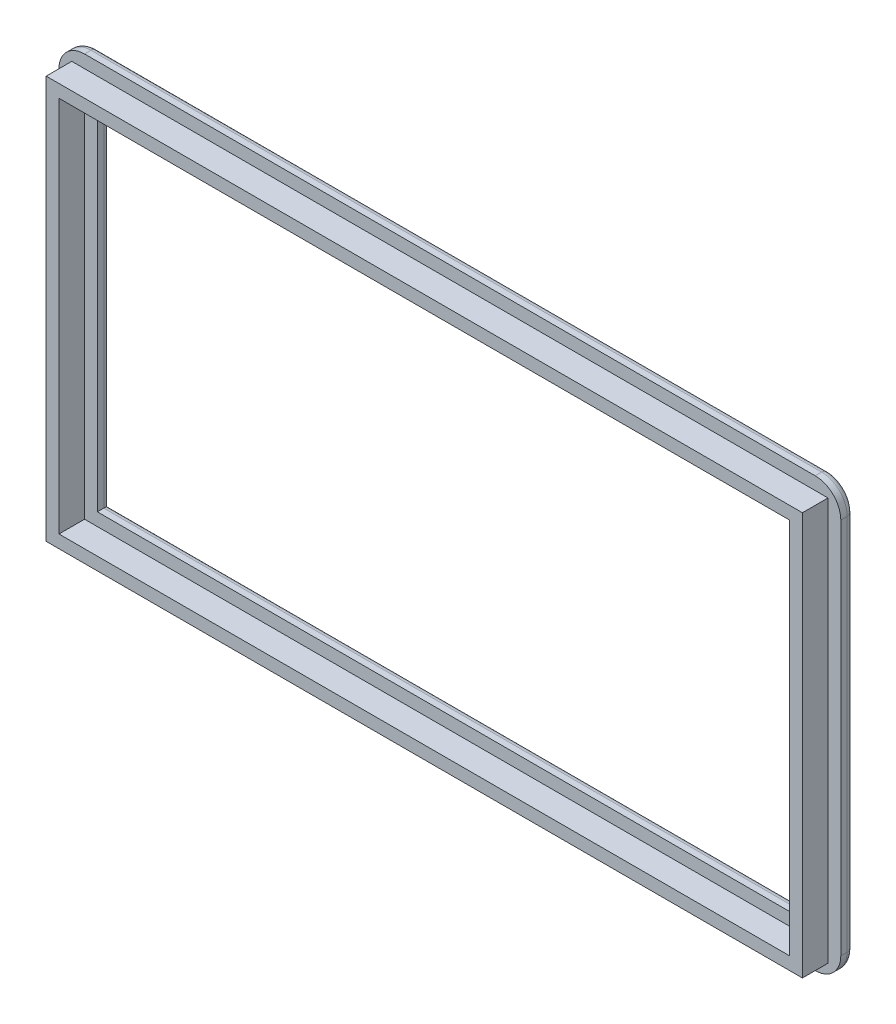
ISO-10303-21;
HEADER;
FILE_DESCRIPTION(('STEP AP214'),'2;1');
FILE_NAME('part.step','',(''),(''),'','','');
FILE_SCHEMA(('AUTOMOTIVE_DESIGN { 1 0 10303 214 1 1 1 1 }'));
ENDSEC;
DATA;
#1=APPLICATION_CONTEXT('core data for automotive mechanical design processes');
#2=APPLICATION_PROTOCOL_DEFINITION('international standard','automotive_design',2000,#1);
#3=PRODUCT_CONTEXT('',#1,'mechanical');
#4=PRODUCT('Part','Part','',(#3));
#5=PRODUCT_RELATED_PRODUCT_CATEGORY('part','',(#4));
#6=PRODUCT_DEFINITION_FORMATION('','',#4);
#7=PRODUCT_DEFINITION_CONTEXT('part definition',#1,'design');
#8=PRODUCT_DEFINITION('design','',#6,#7);
#9=PRODUCT_DEFINITION_SHAPE('','',#8);
#10=(LENGTH_UNIT() NAMED_UNIT(*) SI_UNIT(.MILLI.,.METRE.));
#11=(NAMED_UNIT(*) PLANE_ANGLE_UNIT() SI_UNIT($,.RADIAN.));
#12=(NAMED_UNIT(*) SI_UNIT($,.STERADIAN.) SOLID_ANGLE_UNIT());
#13=UNCERTAINTY_MEASURE_WITH_UNIT(LENGTH_MEASURE(1.E-05),#10,'distance_accuracy_value','');
#14=(GEOMETRIC_REPRESENTATION_CONTEXT(3) GLOBAL_UNCERTAINTY_ASSIGNED_CONTEXT((#13)) GLOBAL_UNIT_ASSIGNED_CONTEXT((#10,
#11,#12)) REPRESENTATION_CONTEXT('',''));
#15=CARTESIAN_POINT('',(0.,0.,0.));
#16=DIRECTION('',(0.,0.,1.));
#17=DIRECTION('',(1.,0.,0.));
#18=AXIS2_PLACEMENT_3D('',#15,#16,#17);
#19=CARTESIAN_POINT('',(28.55,-14.745,1.));
#20=DIRECTION('',(0.,0.,1.));
#21=DIRECTION('',(1.,0.,0.));
#22=AXIS2_PLACEMENT_3D('',#19,#20,#21);
#23=PLANE('',#22);
#24=DIRECTION('',(-1.,0.,0.));
#25=VECTOR('',#24,1.);
#26=CARTESIAN_POINT('',(-27.55,13.745,1.));
#27=LINE('',#26,#25);
#28=CARTESIAN_POINT('',(27.55,13.745,1.));
#29=VERTEX_POINT('',#28);
#30=CARTESIAN_POINT('',(-27.55,13.745,1.));
#31=VERTEX_POINT('',#30);
#32=EDGE_CURVE('E278',#29,#31,#27,.T.);
#33=ORIENTED_EDGE('',*,*,#32,.F.);
#34=DIRECTION('',(0.,1.,0.));
#35=VECTOR('',#34,1.);
#36=CARTESIAN_POINT('',(27.55,13.745,1.));
#37=LINE('',#36,#35);
#38=CARTESIAN_POINT('',(27.55,-13.745,1.));
#39=VERTEX_POINT('',#38);
#40=EDGE_CURVE('E276',#39,#29,#37,.T.);
#41=ORIENTED_EDGE('',*,*,#40,.F.);
#42=DIRECTION('',(1.,0.,0.));
#43=VECTOR('',#42,1.);
#44=CARTESIAN_POINT('',(-27.55,-13.745,1.));
#45=LINE('',#44,#43);
#46=CARTESIAN_POINT('',(-27.55,-13.745,1.));
#47=VERTEX_POINT('',#46);
#48=EDGE_CURVE('E284',#47,#39,#45,.T.);
#49=ORIENTED_EDGE('',*,*,#48,.F.);
#50=DIRECTION('',(0.,-1.,0.));
#51=VECTOR('',#50,1.);
#52=CARTESIAN_POINT('',(-27.55,13.745,1.));
#53=LINE('',#52,#51);
#54=EDGE_CURVE('E281',#31,#47,#53,.T.);
#55=ORIENTED_EDGE('',*,*,#54,.F.);
#56=EDGE_LOOP('',(#33,#41,#49,#55));
#57=FACE_BOUND('',#56,.T.);
#58=DIRECTION('',(0.,-1.,0.));
#59=VECTOR('',#58,1.);
#60=CARTESIAN_POINT('',(-28.55,14.745,1.));
#61=LINE('',#60,#59);
#62=CARTESIAN_POINT('',(-28.55,14.745,1.));
#63=VERTEX_POINT('',#62);
#64=CARTESIAN_POINT('',(-28.55,-14.745,1.));
#65=VERTEX_POINT('',#64);
#66=EDGE_CURVE('E217',#63,#65,#61,.T.);
#67=ORIENTED_EDGE('',*,*,#66,.T.);
#68=DIRECTION('',(1.,0.,0.));
#69=VECTOR('',#68,1.);
#70=CARTESIAN_POINT('',(-28.55,-14.745,1.));
#71=LINE('',#70,#69);
#72=CARTESIAN_POINT('',(28.55,-14.745,1.));
#73=VERTEX_POINT('',#72);
#74=EDGE_CURVE('E235',#65,#73,#71,.T.);
#75=ORIENTED_EDGE('',*,*,#74,.T.);
#76=DIRECTION('',(0.,1.,0.));
#77=VECTOR('',#76,1.);
#78=CARTESIAN_POINT('',(28.55,-14.745,1.));
#79=LINE('',#78,#77);
#80=CARTESIAN_POINT('',(28.55,14.745,1.));
#81=VERTEX_POINT('',#80);
#82=EDGE_CURVE('E223',#73,#81,#79,.T.);
#83=ORIENTED_EDGE('',*,*,#82,.T.);
#84=DIRECTION('',(-1.,0.,0.));
#85=VECTOR('',#84,1.);
#86=CARTESIAN_POINT('',(28.55,14.745,1.));
#87=LINE('',#86,#85);
#88=EDGE_CURVE('E238',#81,#63,#87,.T.);
#89=ORIENTED_EDGE('',*,*,#88,.T.);
#90=EDGE_LOOP('',(#67,#75,#83,#89));
#91=FACE_BOUND('',#90,.T.);
#92=ADVANCED_FACE('F33',(#57,#91),#23,.T.);
#93=DIRECTION('',(0.,1.,0.));
#94=VECTOR('',#93,1.);
#95=CARTESIAN_POINT('',(29.55,-15.745,1.));
#96=LINE('',#95,#94);
#97=CARTESIAN_POINT('',(29.55,-15.745,1.));
#98=VERTEX_POINT('',#97);
#99=CARTESIAN_POINT('',(29.55,15.745,1.));
#100=VERTEX_POINT('',#99);
#101=EDGE_CURVE('E50',#98,#100,#96,.T.);
#102=ORIENTED_EDGE('',*,*,#101,.F.);
#103=DIRECTION('',(1.,0.,0.));
#104=VECTOR('',#103,1.);
#105=CARTESIAN_POINT('',(-29.55,-15.745,1.));
#106=LINE('',#105,#104);
#107=CARTESIAN_POINT('',(-29.55,-15.745,1.));
#108=VERTEX_POINT('',#107);
#109=EDGE_CURVE('E54',#108,#98,#106,.T.);
#110=ORIENTED_EDGE('',*,*,#109,.F.);
#111=DIRECTION('',(0.,-1.,0.));
#112=VECTOR('',#111,1.);
#113=CARTESIAN_POINT('',(-29.55,15.745,1.));
#114=LINE('',#113,#112);
#115=CARTESIAN_POINT('',(-29.55,15.745,1.));
#116=VERTEX_POINT('',#115);
#117=EDGE_CURVE('E261',#116,#108,#114,.T.);
#118=ORIENTED_EDGE('',*,*,#117,.F.);
#119=DIRECTION('',(-1.,0.,0.));
#120=VECTOR('',#119,1.);
#121=CARTESIAN_POINT('',(29.55,15.745,1.));
#122=LINE('',#121,#120);
#123=EDGE_CURVE('E258',#100,#116,#122,.T.);
#124=ORIENTED_EDGE('',*,*,#123,.F.);
#125=EDGE_LOOP('',(#102,#110,#118,#124));
#126=FACE_BOUND('',#125,.T.);
#127=CARTESIAN_POINT('',(28.55,-14.745,1.));
#128=DIRECTION('',(0.,0.,1.));
#129=DIRECTION('',(1.,0.,0.));
#130=AXIS2_PLACEMENT_3D('',#127,#128,#129);
#131=CIRCLE('',#130,2.);
#132=CARTESIAN_POINT('',(28.55,-16.745,1.));
#133=VERTEX_POINT('',#132);
#134=CARTESIAN_POINT('',(30.55,-14.745,1.));
#135=VERTEX_POINT('',#134);
#136=EDGE_CURVE('E298',#133,#135,#131,.T.);
#137=ORIENTED_EDGE('',*,*,#136,.T.);
#138=DIRECTION('',(0.,1.,0.));
#139=VECTOR('',#138,1.);
#140=CARTESIAN_POINT('',(30.55,14.745,1.));
#141=LINE('',#140,#139);
#142=CARTESIAN_POINT('',(30.55,14.745,1.));
#143=VERTEX_POINT('',#142);
#144=EDGE_CURVE('E301',#135,#143,#141,.T.);
#145=ORIENTED_EDGE('',*,*,#144,.T.);
#146=CARTESIAN_POINT('',(28.55,14.745,1.));
#147=DIRECTION('',(0.,0.,1.));
#148=DIRECTION('',(-1.,0.,0.));
#149=AXIS2_PLACEMENT_3D('',#146,#147,#148);
#150=CIRCLE('',#149,2.);
#151=CARTESIAN_POINT('',(28.55,16.745,1.));
#152=VERTEX_POINT('',#151);
#153=EDGE_CURVE('E303',#143,#152,#150,.T.);
#154=ORIENTED_EDGE('',*,*,#153,.T.);
#155=DIRECTION('',(-1.,0.,0.));
#156=VECTOR('',#155,1.);
#157=CARTESIAN_POINT('',(-28.55,16.745,1.));
#158=LINE('',#157,#156);
#159=CARTESIAN_POINT('',(-28.55,16.745,1.));
#160=VERTEX_POINT('',#159);
#161=EDGE_CURVE('E305',#152,#160,#158,.T.);
#162=ORIENTED_EDGE('',*,*,#161,.T.);
#163=CARTESIAN_POINT('',(-28.55,14.745,1.));
#164=DIRECTION('',(0.,0.,1.));
#165=DIRECTION('',(1.,0.,0.));
#166=AXIS2_PLACEMENT_3D('',#163,#164,#165);
#167=CIRCLE('',#166,2.);
#168=CARTESIAN_POINT('',(-30.55,14.745,1.));
#169=VERTEX_POINT('',#168);
#170=EDGE_CURVE('E307',#160,#169,#167,.T.);
#171=ORIENTED_EDGE('',*,*,#170,.T.);
#172=DIRECTION('',(0.,-1.,0.));
#173=VECTOR('',#172,1.);
#174=CARTESIAN_POINT('',(-30.55,14.745,1.));
#175=LINE('',#174,#173);
#176=CARTESIAN_POINT('',(-30.55,-14.745,1.));
#177=VERTEX_POINT('',#176);
#178=EDGE_CURVE('E309',#169,#177,#175,.T.);
#179=ORIENTED_EDGE('',*,*,#178,.T.);
#180=CARTESIAN_POINT('',(-28.55,-14.745,1.));
#181=DIRECTION('',(0.,0.,1.));
#182=DIRECTION('',(1.,0.,0.));
#183=AXIS2_PLACEMENT_3D('',#180,#181,#182);
#184=CIRCLE('',#183,2.);
#185=CARTESIAN_POINT('',(-28.55,-16.745,1.));
#186=VERTEX_POINT('',#185);
#187=EDGE_CURVE('E311',#177,#186,#184,.T.);
#188=ORIENTED_EDGE('',*,*,#187,.T.);
#189=DIRECTION('',(1.,0.,0.));
#190=VECTOR('',#189,1.);
#191=CARTESIAN_POINT('',(-28.55,-16.745,1.));
#192=LINE('',#191,#190);
#193=EDGE_CURVE('E313',#186,#133,#192,.T.);
#194=ORIENTED_EDGE('',*,*,#193,.T.);
#195=EDGE_LOOP('',(#137,#145,#154,#162,#171,#179,#188,#194));
#196=FACE_BOUND('',#195,.T.);
#197=ADVANCED_FACE('F451',(#126,#196),#23,.T.);
#198=CARTESIAN_POINT('',(28.55,-14.745,0.));
#199=DIRECTION('',(0.,0.,1.));
#200=DIRECTION('',(1.,0.,0.));
#201=AXIS2_PLACEMENT_3D('',#198,#199,#200);
#202=PLANE('',#201);
#203=DIRECTION('',(0.,-1.,0.));
#204=VECTOR('',#203,1.);
#205=CARTESIAN_POINT('',(-28.05,-13.745,0.));
#206=LINE('',#205,#204);
#207=CARTESIAN_POINT('',(-28.05,14.245,0.));
#208=VERTEX_POINT('',#207);
#209=CARTESIAN_POINT('',(-28.05,-14.245,0.));
#210=VERTEX_POINT('',#209);
#211=EDGE_CURVE('E360',#208,#210,#206,.T.);
#212=ORIENTED_EDGE('',*,*,#211,.T.);
#213=DIRECTION('',(1.,0.,0.));
#214=VECTOR('',#213,1.);
#215=CARTESIAN_POINT('',(27.55,-14.245,0.));
#216=LINE('',#215,#214);
#217=CARTESIAN_POINT('',(28.05,-14.245,0.));
#218=VERTEX_POINT('',#217);
#219=EDGE_CURVE('E362',#210,#218,#216,.T.);
#220=ORIENTED_EDGE('',*,*,#219,.T.);
#221=DIRECTION('',(0.,1.,0.));
#222=VECTOR('',#221,1.);
#223=CARTESIAN_POINT('',(28.05,13.745,0.));
#224=LINE('',#223,#222);
#225=CARTESIAN_POINT('',(28.05,14.245,0.));
#226=VERTEX_POINT('',#225);
#227=EDGE_CURVE('E356',#218,#226,#224,.T.);
#228=ORIENTED_EDGE('',*,*,#227,.T.);
#229=DIRECTION('',(-1.,0.,0.));
#230=VECTOR('',#229,1.);
#231=CARTESIAN_POINT('',(-27.55,14.245,0.));
#232=LINE('',#231,#230);
#233=EDGE_CURVE('E358',#226,#208,#232,.T.);
#234=ORIENTED_EDGE('',*,*,#233,.T.);
#235=EDGE_LOOP('',(#212,#220,#228,#234));
#236=FACE_BOUND('',#235,.T.);
#237=CARTESIAN_POINT('',(28.55,14.745,0.));
#238=DIRECTION('',(0.,0.,1.));
#239=DIRECTION('',(1.,0.,0.));
#240=AXIS2_PLACEMENT_3D('',#237,#238,#239);
#241=CIRCLE('',#240,1.5);
#242=CARTESIAN_POINT('',(28.55,16.245,0.));
#243=VERTEX_POINT('',#242);
#244=CARTESIAN_POINT('',(30.05,14.745,0.));
#245=VERTEX_POINT('',#244);
#246=EDGE_CURVE('E351',#243,#245,#241,.F.);
#247=ORIENTED_EDGE('',*,*,#246,.T.);
#248=DIRECTION('',(0.,1.,0.));
#249=VECTOR('',#248,1.);
#250=CARTESIAN_POINT('',(30.05,-14.745,0.));
#251=LINE('',#250,#249);
#252=CARTESIAN_POINT('',(30.05,-14.745,0.));
#253=VERTEX_POINT('',#252);
#254=EDGE_CURVE('E353',#245,#253,#251,.F.);
#255=ORIENTED_EDGE('',*,*,#254,.T.);
#256=CARTESIAN_POINT('',(28.55,-14.745,0.));
#257=DIRECTION('',(0.,0.,1.));
#258=DIRECTION('',(1.,0.,0.));
#259=AXIS2_PLACEMENT_3D('',#256,#257,#258);
#260=CIRCLE('',#259,1.5);
#261=CARTESIAN_POINT('',(28.55,-16.245,0.));
#262=VERTEX_POINT('',#261);
#263=EDGE_CURVE('E339',#253,#262,#260,.F.);
#264=ORIENTED_EDGE('',*,*,#263,.T.);
#265=DIRECTION('',(1.,0.,0.));
#266=VECTOR('',#265,1.);
#267=CARTESIAN_POINT('',(28.55,-16.245,0.));
#268=LINE('',#267,#266);
#269=CARTESIAN_POINT('',(-28.55,-16.245,0.));
#270=VERTEX_POINT('',#269);
#271=EDGE_CURVE('E341',#262,#270,#268,.F.);
#272=ORIENTED_EDGE('',*,*,#271,.T.);
#273=CARTESIAN_POINT('',(-28.55,-14.745,0.));
#274=DIRECTION('',(0.,0.,1.));
#275=DIRECTION('',(1.,0.,0.));
#276=AXIS2_PLACEMENT_3D('',#273,#274,#275);
#277=CIRCLE('',#276,1.5);
#278=CARTESIAN_POINT('',(-30.05,-14.745,0.));
#279=VERTEX_POINT('',#278);
#280=EDGE_CURVE('E343',#270,#279,#277,.F.);
#281=ORIENTED_EDGE('',*,*,#280,.T.);
#282=DIRECTION('',(0.,-1.,0.));
#283=VECTOR('',#282,1.);
#284=CARTESIAN_POINT('',(-30.05,-14.745,0.));
#285=LINE('',#284,#283);
#286=CARTESIAN_POINT('',(-30.05,14.745,0.));
#287=VERTEX_POINT('',#286);
#288=EDGE_CURVE('E345',#279,#287,#285,.F.);
#289=ORIENTED_EDGE('',*,*,#288,.T.);
#290=CARTESIAN_POINT('',(-28.55,14.745,0.));
#291=DIRECTION('',(0.,0.,1.));
#292=DIRECTION('',(1.,0.,0.));
#293=AXIS2_PLACEMENT_3D('',#290,#291,#292);
#294=CIRCLE('',#293,1.5);
#295=CARTESIAN_POINT('',(-28.55,16.245,0.));
#296=VERTEX_POINT('',#295);
#297=EDGE_CURVE('E347',#287,#296,#294,.F.);
#298=ORIENTED_EDGE('',*,*,#297,.T.);
#299=DIRECTION('',(-1.,0.,0.));
#300=VECTOR('',#299,1.);
#301=CARTESIAN_POINT('',(28.55,16.245,0.));
#302=LINE('',#301,#300);
#303=EDGE_CURVE('E349',#296,#243,#302,.F.);
#304=ORIENTED_EDGE('',*,*,#303,.T.);
#305=EDGE_LOOP('',(#247,#255,#264,#272,#281,#289,#298,#304));
#306=FACE_BOUND('',#305,.T.);
#307=ADVANCED_FACE('F428',(#236,#306),#202,.F.);
#308=CARTESIAN_POINT('',(28.55,-14.745,1.));
#309=DIRECTION('',(0.,0.,-1.));
#310=DIRECTION('',(-1.,0.,0.));
#311=AXIS2_PLACEMENT_3D('',#308,#309,#310);
#312=CYLINDRICAL_SURFACE('',#311,2.);
#313=DIRECTION('',(0.,0.,-1.));
#314=VECTOR('',#313,1.);
#315=CARTESIAN_POINT('',(28.55,-16.745,1.));
#316=LINE('',#315,#314);
#317=CARTESIAN_POINT('',(28.55,-16.745,0.5));
#318=VERTEX_POINT('',#317);
#319=EDGE_CURVE('E315',#133,#318,#316,.T.);
#320=ORIENTED_EDGE('',*,*,#319,.T.);
#321=CARTESIAN_POINT('',(28.55,-14.745,0.5));
#322=DIRECTION('',(0.,0.,1.));
#323=DIRECTION('',(1.,0.,0.));
#324=AXIS2_PLACEMENT_3D('',#321,#322,#323);
#325=CIRCLE('',#324,2.);
#326=CARTESIAN_POINT('',(30.55,-14.745,0.5));
#327=VERTEX_POINT('',#326);
#328=EDGE_CURVE('E11',#318,#327,#325,.T.);
#329=ORIENTED_EDGE('',*,*,#328,.T.);
#330=DIRECTION('',(0.,0.,-1.));
#331=VECTOR('',#330,1.);
#332=CARTESIAN_POINT('',(30.55,-14.745,1.));
#333=LINE('',#332,#331);
#334=EDGE_CURVE('E336',#135,#327,#333,.T.);
#335=ORIENTED_EDGE('',*,*,#334,.F.);
#336=ORIENTED_EDGE('',*,*,#136,.F.);
#337=EDGE_LOOP('',(#320,#329,#335,#336));
#338=FACE_BOUND('',#337,.T.);
#339=ADVANCED_FACE('F443',(#338),#312,.T.);
#340=CARTESIAN_POINT('',(30.55,14.745,1.));
#341=DIRECTION('',(-1.,0.,0.));
#342=DIRECTION('',(0.,0.,1.));
#343=AXIS2_PLACEMENT_3D('',#340,#341,#342);
#344=PLANE('',#343);
#345=ORIENTED_EDGE('',*,*,#334,.T.);
#346=DIRECTION('',(0.,1.,0.));
#347=VECTOR('',#346,1.);
#348=CARTESIAN_POINT('',(30.55,14.745,0.5));
#349=LINE('',#348,#347);
#350=CARTESIAN_POINT('',(30.55,14.745,0.5));
#351=VERTEX_POINT('',#350);
#352=EDGE_CURVE('E374',#327,#351,#349,.T.);
#353=ORIENTED_EDGE('',*,*,#352,.T.);
#354=DIRECTION('',(0.,0.,-1.));
#355=VECTOR('',#354,1.);
#356=CARTESIAN_POINT('',(30.55,14.745,1.));
#357=LINE('',#356,#355);
#358=EDGE_CURVE('E333',#143,#351,#357,.T.);
#359=ORIENTED_EDGE('',*,*,#358,.F.);
#360=ORIENTED_EDGE('',*,*,#144,.F.);
#361=EDGE_LOOP('',(#345,#353,#359,#360));
#362=FACE_BOUND('',#361,.T.);
#363=ADVANCED_FACE('F447',(#362),#344,.F.);
#364=CARTESIAN_POINT('',(28.55,14.745,1.));
#365=DIRECTION('',(0.,0.,-1.));
#366=DIRECTION('',(-1.,0.,0.));
#367=AXIS2_PLACEMENT_3D('',#364,#365,#366);
#368=CYLINDRICAL_SURFACE('',#367,2.);
#369=ORIENTED_EDGE('',*,*,#358,.T.);
#370=CARTESIAN_POINT('',(28.55,14.745,0.5));
#371=DIRECTION('',(0.,0.,1.));
#372=DIRECTION('',(1.,0.,0.));
#373=AXIS2_PLACEMENT_3D('',#370,#371,#372);
#374=CIRCLE('',#373,2.);
#375=CARTESIAN_POINT('',(28.55,16.745,0.5));
#376=VERTEX_POINT('',#375);
#377=EDGE_CURVE('E377',#351,#376,#374,.T.);
#378=ORIENTED_EDGE('',*,*,#377,.T.);
#379=DIRECTION('',(0.,0.,-1.));
#380=VECTOR('',#379,1.);
#381=CARTESIAN_POINT('',(28.55,16.745,1.));
#382=LINE('',#381,#380);
#383=EDGE_CURVE('E330',#152,#376,#382,.T.);
#384=ORIENTED_EDGE('',*,*,#383,.F.);
#385=ORIENTED_EDGE('',*,*,#153,.F.);
#386=EDGE_LOOP('',(#369,#378,#384,#385));
#387=FACE_BOUND('',#386,.T.);
#388=ADVANCED_FACE('F484',(#387),#368,.T.);
#389=CARTESIAN_POINT('',(-28.55,16.745,1.));
#390=DIRECTION('',(0.,-1.,0.));
#391=DIRECTION('',(0.,0.,-1.));
#392=AXIS2_PLACEMENT_3D('',#389,#390,#391);
#393=PLANE('',#392);
#394=ORIENTED_EDGE('',*,*,#383,.T.);
#395=DIRECTION('',(-1.,0.,0.));
#396=VECTOR('',#395,1.);
#397=CARTESIAN_POINT('',(-28.55,16.745,0.5));
#398=LINE('',#397,#396);
#399=CARTESIAN_POINT('',(-28.55,16.745,0.5));
#400=VERTEX_POINT('',#399);
#401=EDGE_CURVE('E379',#376,#400,#398,.T.);
#402=ORIENTED_EDGE('',*,*,#401,.T.);
#403=DIRECTION('',(0.,0.,-1.));
#404=VECTOR('',#403,1.);
#405=CARTESIAN_POINT('',(-28.55,16.745,1.));
#406=LINE('',#405,#404);
#407=EDGE_CURVE('E327',#160,#400,#406,.T.);
#408=ORIENTED_EDGE('',*,*,#407,.F.);
#409=ORIENTED_EDGE('',*,*,#161,.F.);
#410=EDGE_LOOP('',(#394,#402,#408,#409));
#411=FACE_BOUND('',#410,.T.);
#412=ADVANCED_FACE('F487',(#411),#393,.F.);
#413=CARTESIAN_POINT('',(-28.55,14.745,1.));
#414=DIRECTION('',(0.,0.,-1.));
#415=DIRECTION('',(-1.,0.,0.));
#416=AXIS2_PLACEMENT_3D('',#413,#414,#415);
#417=CYLINDRICAL_SURFACE('',#416,2.);
#418=ORIENTED_EDGE('',*,*,#407,.T.);
#419=CARTESIAN_POINT('',(-28.55,14.745,0.5));
#420=DIRECTION('',(0.,0.,1.));
#421=DIRECTION('',(1.,0.,0.));
#422=AXIS2_PLACEMENT_3D('',#419,#420,#421);
#423=CIRCLE('',#422,2.);
#424=CARTESIAN_POINT('',(-30.55,14.745,0.5));
#425=VERTEX_POINT('',#424);
#426=EDGE_CURVE('E381',#400,#425,#423,.T.);
#427=ORIENTED_EDGE('',*,*,#426,.T.);
#428=DIRECTION('',(0.,0.,-1.));
#429=VECTOR('',#428,1.);
#430=CARTESIAN_POINT('',(-30.55,14.745,1.));
#431=LINE('',#430,#429);
#432=EDGE_CURVE('E324',#169,#425,#431,.T.);
#433=ORIENTED_EDGE('',*,*,#432,.F.);
#434=ORIENTED_EDGE('',*,*,#170,.F.);
#435=EDGE_LOOP('',(#418,#427,#433,#434));
#436=FACE_BOUND('',#435,.T.);
#437=ADVANCED_FACE('F466',(#436),#417,.T.);
#438=CARTESIAN_POINT('',(-30.55,14.745,1.));
#439=DIRECTION('',(1.,0.,0.));
#440=DIRECTION('',(0.,0.,-1.));
#441=AXIS2_PLACEMENT_3D('',#438,#439,#440);
#442=PLANE('',#441);
#443=ORIENTED_EDGE('',*,*,#432,.T.);
#444=DIRECTION('',(0.,-1.,0.));
#445=VECTOR('',#444,1.);
#446=CARTESIAN_POINT('',(-30.55,14.745,0.5));
#447=LINE('',#446,#445);
#448=CARTESIAN_POINT('',(-30.55,-14.745,0.5));
#449=VERTEX_POINT('',#448);
#450=EDGE_CURVE('E383',#425,#449,#447,.T.);
#451=ORIENTED_EDGE('',*,*,#450,.T.);
#452=DIRECTION('',(0.,0.,-1.));
#453=VECTOR('',#452,1.);
#454=CARTESIAN_POINT('',(-30.55,-14.745,1.));
#455=LINE('',#454,#453);
#456=EDGE_CURVE('E321',#177,#449,#455,.T.);
#457=ORIENTED_EDGE('',*,*,#456,.F.);
#458=ORIENTED_EDGE('',*,*,#178,.F.);
#459=EDGE_LOOP('',(#443,#451,#457,#458));
#460=FACE_BOUND('',#459,.T.);
#461=ADVANCED_FACE('F462',(#460),#442,.F.);
#462=CARTESIAN_POINT('',(-28.55,-14.745,1.));
#463=DIRECTION('',(0.,0.,-1.));
#464=DIRECTION('',(-1.,0.,0.));
#465=AXIS2_PLACEMENT_3D('',#462,#463,#464);
#466=CYLINDRICAL_SURFACE('',#465,2.);
#467=ORIENTED_EDGE('',*,*,#456,.T.);
#468=CARTESIAN_POINT('',(-28.55,-14.745,0.5));
#469=DIRECTION('',(0.,0.,1.));
#470=DIRECTION('',(1.,0.,0.));
#471=AXIS2_PLACEMENT_3D('',#468,#469,#470);
#472=CIRCLE('',#471,2.);
#473=CARTESIAN_POINT('',(-28.55,-16.745,0.5));
#474=VERTEX_POINT('',#473);
#475=EDGE_CURVE('E385',#449,#474,#472,.T.);
#476=ORIENTED_EDGE('',*,*,#475,.T.);
#477=DIRECTION('',(0.,0.,-1.));
#478=VECTOR('',#477,1.);
#479=CARTESIAN_POINT('',(-28.55,-16.745,1.));
#480=LINE('',#479,#478);
#481=EDGE_CURVE('E318',#186,#474,#480,.T.);
#482=ORIENTED_EDGE('',*,*,#481,.F.);
#483=ORIENTED_EDGE('',*,*,#187,.F.);
#484=EDGE_LOOP('',(#467,#476,#482,#483));
#485=FACE_BOUND('',#484,.T.);
#486=ADVANCED_FACE('F458',(#485),#466,.T.);
#487=CARTESIAN_POINT('',(-28.55,-16.745,1.));
#488=DIRECTION('',(0.,1.,0.));
#489=DIRECTION('',(0.,0.,1.));
#490=AXIS2_PLACEMENT_3D('',#487,#488,#489);
#491=PLANE('',#490);
#492=ORIENTED_EDGE('',*,*,#481,.T.);
#493=DIRECTION('',(1.,0.,0.));
#494=VECTOR('',#493,1.);
#495=CARTESIAN_POINT('',(-28.55,-16.745,0.5));
#496=LINE('',#495,#494);
#497=EDGE_CURVE('E42',#474,#318,#496,.T.);
#498=ORIENTED_EDGE('',*,*,#497,.T.);
#499=ORIENTED_EDGE('',*,*,#319,.F.);
#500=ORIENTED_EDGE('',*,*,#193,.F.);
#501=EDGE_LOOP('',(#492,#498,#499,#500));
#502=FACE_BOUND('',#501,.T.);
#503=ADVANCED_FACE('F456',(#502),#491,.F.);
#504=CARTESIAN_POINT('',(27.55,13.745,1.));
#505=DIRECTION('',(-1.,0.,0.));
#506=DIRECTION('',(0.,0.,1.));
#507=AXIS2_PLACEMENT_3D('',#504,#505,#506);
#508=PLANE('',#507);
#509=DIRECTION('',(0.,0.,-1.));
#510=VECTOR('',#509,1.);
#511=CARTESIAN_POINT('',(27.55,13.745,1.));
#512=LINE('',#511,#510);
#513=CARTESIAN_POINT('',(27.55,13.745,0.5));
#514=VERTEX_POINT('',#513);
#515=EDGE_CURVE('E295',#29,#514,#512,.T.);
#516=ORIENTED_EDGE('',*,*,#515,.T.);
#517=DIRECTION('',(0.,1.,0.));
#518=VECTOR('',#517,1.);
#519=CARTESIAN_POINT('',(27.55,-13.745,0.5));
#520=LINE('',#519,#518);
#521=CARTESIAN_POINT('',(27.55,-13.745,0.5));
#522=VERTEX_POINT('',#521);
#523=EDGE_CURVE('E372',#514,#522,#520,.F.);
#524=ORIENTED_EDGE('',*,*,#523,.T.);
#525=DIRECTION('',(0.,0.,-1.));
#526=VECTOR('',#525,1.);
#527=CARTESIAN_POINT('',(27.55,-13.745,1.));
#528=LINE('',#527,#526);
#529=EDGE_CURVE('E286',#39,#522,#528,.T.);
#530=ORIENTED_EDGE('',*,*,#529,.F.);
#531=ORIENTED_EDGE('',*,*,#40,.T.);
#532=EDGE_LOOP('',(#516,#524,#530,#531));
#533=FACE_BOUND('',#532,.T.);
#534=ADVANCED_FACE('F506',(#533),#508,.T.);
#535=CARTESIAN_POINT('',(-27.55,13.745,1.));
#536=DIRECTION('',(0.,-1.,0.));
#537=DIRECTION('',(0.,0.,-1.));
#538=AXIS2_PLACEMENT_3D('',#535,#536,#537);
#539=PLANE('',#538);
#540=DIRECTION('',(0.,0.,-1.));
#541=VECTOR('',#540,1.);
#542=CARTESIAN_POINT('',(-27.55,13.745,1.));
#543=LINE('',#542,#541);
#544=CARTESIAN_POINT('',(-27.55,13.745,0.5));
#545=VERTEX_POINT('',#544);
#546=EDGE_CURVE('E292',#31,#545,#543,.T.);
#547=ORIENTED_EDGE('',*,*,#546,.T.);
#548=DIRECTION('',(-1.,0.,0.));
#549=VECTOR('',#548,1.);
#550=CARTESIAN_POINT('',(27.55,13.745,0.5));
#551=LINE('',#550,#549);
#552=EDGE_CURVE('E370',#545,#514,#551,.F.);
#553=ORIENTED_EDGE('',*,*,#552,.T.);
#554=ORIENTED_EDGE('',*,*,#515,.F.);
#555=ORIENTED_EDGE('',*,*,#32,.T.);
#556=EDGE_LOOP('',(#547,#553,#554,#555));
#557=FACE_BOUND('',#556,.T.);
#558=ADVANCED_FACE('F534',(#557),#539,.T.);
#559=CARTESIAN_POINT('',(-27.55,13.745,1.));
#560=DIRECTION('',(1.,0.,0.));
#561=DIRECTION('',(0.,0.,-1.));
#562=AXIS2_PLACEMENT_3D('',#559,#560,#561);
#563=PLANE('',#562);
#564=DIRECTION('',(0.,0.,-1.));
#565=VECTOR('',#564,1.);
#566=CARTESIAN_POINT('',(-27.55,-13.745,1.));
#567=LINE('',#566,#565);
#568=CARTESIAN_POINT('',(-27.55,-13.745,0.5));
#569=VERTEX_POINT('',#568);
#570=EDGE_CURVE('E289',#47,#569,#567,.T.);
#571=ORIENTED_EDGE('',*,*,#570,.T.);
#572=DIRECTION('',(0.,-1.,0.));
#573=VECTOR('',#572,1.);
#574=CARTESIAN_POINT('',(-27.55,13.745,0.5));
#575=LINE('',#574,#573);
#576=EDGE_CURVE('E368',#569,#545,#575,.F.);
#577=ORIENTED_EDGE('',*,*,#576,.T.);
#578=ORIENTED_EDGE('',*,*,#546,.F.);
#579=ORIENTED_EDGE('',*,*,#54,.T.);
#580=EDGE_LOOP('',(#571,#577,#578,#579));
#581=FACE_BOUND('',#580,.T.);
#582=ADVANCED_FACE('F541',(#581),#563,.T.);
#583=CARTESIAN_POINT('',(-27.55,-13.745,1.));
#584=DIRECTION('',(0.,1.,0.));
#585=DIRECTION('',(0.,0.,1.));
#586=AXIS2_PLACEMENT_3D('',#583,#584,#585);
#587=PLANE('',#586);
#588=ORIENTED_EDGE('',*,*,#529,.T.);
#589=DIRECTION('',(1.,0.,0.));
#590=VECTOR('',#589,1.);
#591=CARTESIAN_POINT('',(-27.55,-13.745,0.5));
#592=LINE('',#591,#590);
#593=EDGE_CURVE('E365',#522,#569,#592,.F.);
#594=ORIENTED_EDGE('',*,*,#593,.T.);
#595=ORIENTED_EDGE('',*,*,#570,.F.);
#596=ORIENTED_EDGE('',*,*,#48,.T.);
#597=EDGE_LOOP('',(#588,#594,#595,#596));
#598=FACE_BOUND('',#597,.T.);
#599=ADVANCED_FACE('F548',(#598),#587,.T.);
#600=CARTESIAN_POINT('',(28.55,14.245,0.5));
#601=DIRECTION('',(1.,0.,0.));
#602=DIRECTION('',(0.,0.,-1.));
#603=AXIS2_PLACEMENT_3D('',#600,#601,#602);
#604=CYLINDRICAL_SURFACE('',#603,0.5);
#605=CARTESIAN_POINT('',(28.05,14.245,0.5));
#606=DIRECTION('',(0.707106781186547,-0.707106781186547,0.));
#607=DIRECTION('',(0.707106781186547,0.707106781186547,0.));
#608=AXIS2_PLACEMENT_3D('',#605,#606,#607);
#609=ELLIPSE('',#608,0.707106781186547,0.5);
#610=EDGE_CURVE('E392',#514,#226,#609,.T.);
#611=ORIENTED_EDGE('',*,*,#610,.F.);
#612=ORIENTED_EDGE('',*,*,#552,.F.);
#613=CARTESIAN_POINT('',(-28.05,14.245,0.5));
#614=DIRECTION('',(0.707106781186547,0.707106781186547,0.));
#615=DIRECTION('',(-0.707106781186547,0.707106781186547,0.));
#616=AXIS2_PLACEMENT_3D('',#613,#614,#615);
#617=ELLIPSE('',#616,0.707106781186547,0.5);
#618=EDGE_CURVE('E279',#208,#545,#617,.F.);
#619=ORIENTED_EDGE('',*,*,#618,.F.);
#620=ORIENTED_EDGE('',*,*,#233,.F.);
#621=EDGE_LOOP('',(#611,#612,#619,#620));
#622=FACE_BOUND('',#621,.T.);
#623=ADVANCED_FACE('F556',(#622),#604,.T.);
#624=CARTESIAN_POINT('',(-28.05,-14.745,0.5));
#625=DIRECTION('',(0.,1.,0.));
#626=DIRECTION('',(0.,0.,1.));
#627=AXIS2_PLACEMENT_3D('',#624,#625,#626);
#628=CYLINDRICAL_SURFACE('',#627,0.5);
#629=ORIENTED_EDGE('',*,*,#618,.T.);
#630=ORIENTED_EDGE('',*,*,#576,.F.);
#631=CARTESIAN_POINT('',(-28.05,-14.245,0.5));
#632=DIRECTION('',(-0.707106781186547,0.707106781186547,0.));
#633=DIRECTION('',(-0.707106781186547,-0.707106781186547,0.));
#634=AXIS2_PLACEMENT_3D('',#631,#632,#633);
#635=ELLIPSE('',#634,0.707106781186547,0.5);
#636=EDGE_CURVE('E390',#210,#569,#635,.F.);
#637=ORIENTED_EDGE('',*,*,#636,.F.);
#638=ORIENTED_EDGE('',*,*,#211,.F.);
#639=EDGE_LOOP('',(#629,#630,#637,#638));
#640=FACE_BOUND('',#639,.T.);
#641=ADVANCED_FACE('F564',(#640),#628,.T.);
#642=CARTESIAN_POINT('',(28.05,-14.745,0.5));
#643=DIRECTION('',(0.,-1.,0.));
#644=DIRECTION('',(0.,0.,-1.));
#645=AXIS2_PLACEMENT_3D('',#642,#643,#644);
#646=CYLINDRICAL_SURFACE('',#645,0.5);
#647=ORIENTED_EDGE('',*,*,#610,.T.);
#648=ORIENTED_EDGE('',*,*,#227,.F.);
#649=CARTESIAN_POINT('',(28.05,-14.245,0.5));
#650=DIRECTION('',(-0.707106781186547,-0.707106781186547,0.));
#651=DIRECTION('',(-0.707106781186547,0.707106781186547,0.));
#652=AXIS2_PLACEMENT_3D('',#649,#650,#651);
#653=ELLIPSE('',#652,0.707106781186547,0.5);
#654=EDGE_CURVE('E388',#522,#218,#653,.T.);
#655=ORIENTED_EDGE('',*,*,#654,.F.);
#656=ORIENTED_EDGE('',*,*,#523,.F.);
#657=EDGE_LOOP('',(#647,#648,#655,#656));
#658=FACE_BOUND('',#657,.T.);
#659=ADVANCED_FACE('F572',(#658),#646,.T.);
#660=CARTESIAN_POINT('',(28.55,-14.245,0.5));
#661=DIRECTION('',(-1.,0.,0.));
#662=DIRECTION('',(0.,0.,1.));
#663=AXIS2_PLACEMENT_3D('',#660,#661,#662);
#664=CYLINDRICAL_SURFACE('',#663,0.5);
#665=ORIENTED_EDGE('',*,*,#636,.T.);
#666=ORIENTED_EDGE('',*,*,#593,.F.);
#667=ORIENTED_EDGE('',*,*,#654,.T.);
#668=ORIENTED_EDGE('',*,*,#219,.F.);
#669=EDGE_LOOP('',(#665,#666,#667,#668));
#670=FACE_BOUND('',#669,.T.);
#671=ADVANCED_FACE('F580',(#670),#664,.T.);
#672=CARTESIAN_POINT('',(-30.05,14.745,0.5));
#673=DIRECTION('',(0.,-1.,0.));
#674=DIRECTION('',(0.,0.,-1.));
#675=AXIS2_PLACEMENT_3D('',#672,#673,#674);
#676=CYLINDRICAL_SURFACE('',#675,0.5);
#677=CARTESIAN_POINT('',(-30.05,14.745,0.5));
#678=DIRECTION('',(0.,1.,0.));
#679=DIRECTION('',(0.,0.,1.));
#680=AXIS2_PLACEMENT_3D('',#677,#678,#679);
#681=CIRCLE('',#680,0.5);
#682=EDGE_CURVE('E411',#287,#425,#681,.T.);
#683=ORIENTED_EDGE('',*,*,#682,.F.);
#684=ORIENTED_EDGE('',*,*,#288,.F.);
#685=CARTESIAN_POINT('',(-30.05,-14.745,0.5));
#686=DIRECTION('',(0.,-1.,0.));
#687=DIRECTION('',(0.,0.,-1.));
#688=AXIS2_PLACEMENT_3D('',#685,#686,#687);
#689=CIRCLE('',#688,0.5);
#690=EDGE_CURVE('E37',#449,#279,#689,.T.);
#691=ORIENTED_EDGE('',*,*,#690,.F.);
#692=ORIENTED_EDGE('',*,*,#450,.F.);
#693=EDGE_LOOP('',(#683,#684,#691,#692));
#694=FACE_BOUND('',#693,.T.);
#695=ADVANCED_FACE('F35',(#694),#676,.T.);
#696=CARTESIAN_POINT('',(-28.55,-14.745,0.5));
#697=DIRECTION('',(0.,0.,1.));
#698=DIRECTION('',(1.,0.,0.));
#699=AXIS2_PLACEMENT_3D('',#696,#697,#698);
#700=TOROIDAL_SURFACE('',#699,1.5,0.5);
#701=ORIENTED_EDGE('',*,*,#690,.T.);
#702=ORIENTED_EDGE('',*,*,#280,.F.);
#703=CARTESIAN_POINT('',(-28.55,-16.245,0.5));
#704=DIRECTION('',(1.,0.,0.));
#705=DIRECTION('',(0.,0.,-1.));
#706=AXIS2_PLACEMENT_3D('',#703,#704,#705);
#707=CIRCLE('',#706,0.5);
#708=EDGE_CURVE('E409',#474,#270,#707,.T.);
#709=ORIENTED_EDGE('',*,*,#708,.F.);
#710=ORIENTED_EDGE('',*,*,#475,.F.);
#711=EDGE_LOOP('',(#701,#702,#709,#710));
#712=FACE_BOUND('',#711,.T.);
#713=ADVANCED_FACE('F422',(#712),#700,.T.);
#714=CARTESIAN_POINT('',(-28.55,14.745,0.5));
#715=DIRECTION('',(0.,0.,1.));
#716=DIRECTION('',(1.,0.,0.));
#717=AXIS2_PLACEMENT_3D('',#714,#715,#716);
#718=TOROIDAL_SURFACE('',#717,1.5,0.5);
#719=ORIENTED_EDGE('',*,*,#682,.T.);
#720=ORIENTED_EDGE('',*,*,#426,.F.);
#721=CARTESIAN_POINT('',(-28.55,16.245,0.5));
#722=DIRECTION('',(1.,0.,0.));
#723=DIRECTION('',(0.,0.,-1.));
#724=AXIS2_PLACEMENT_3D('',#721,#722,#723);
#725=CIRCLE('',#724,0.5);
#726=EDGE_CURVE('E406',#296,#400,#725,.T.);
#727=ORIENTED_EDGE('',*,*,#726,.F.);
#728=ORIENTED_EDGE('',*,*,#297,.F.);
#729=EDGE_LOOP('',(#719,#720,#727,#728));
#730=FACE_BOUND('',#729,.T.);
#731=ADVANCED_FACE('F468',(#730),#718,.T.);
#732=CARTESIAN_POINT('',(-28.55,-16.245,0.5));
#733=DIRECTION('',(1.,0.,0.));
#734=DIRECTION('',(0.,0.,-1.));
#735=AXIS2_PLACEMENT_3D('',#732,#733,#734);
#736=CYLINDRICAL_SURFACE('',#735,0.5);
#737=ORIENTED_EDGE('',*,*,#708,.T.);
#738=ORIENTED_EDGE('',*,*,#271,.F.);
#739=CARTESIAN_POINT('',(28.55,-16.245,0.5));
#740=DIRECTION('',(1.,0.,0.));
#741=DIRECTION('',(0.,0.,-1.));
#742=AXIS2_PLACEMENT_3D('',#739,#740,#741);
#743=CIRCLE('',#742,0.5);
#744=EDGE_CURVE('E403',#318,#262,#743,.T.);
#745=ORIENTED_EDGE('',*,*,#744,.F.);
#746=ORIENTED_EDGE('',*,*,#497,.F.);
#747=EDGE_LOOP('',(#737,#738,#745,#746));
#748=FACE_BOUND('',#747,.T.);
#749=ADVANCED_FACE('F434',(#748),#736,.T.);
#750=CARTESIAN_POINT('',(-28.55,16.245,0.5));
#751=DIRECTION('',(-1.,0.,0.));
#752=DIRECTION('',(0.,0.,1.));
#753=AXIS2_PLACEMENT_3D('',#750,#751,#752);
#754=CYLINDRICAL_SURFACE('',#753,0.5);
#755=ORIENTED_EDGE('',*,*,#726,.T.);
#756=ORIENTED_EDGE('',*,*,#401,.F.);
#757=CARTESIAN_POINT('',(28.55,16.245,0.5));
#758=DIRECTION('',(1.,0.,0.));
#759=DIRECTION('',(0.,0.,-1.));
#760=AXIS2_PLACEMENT_3D('',#757,#758,#759);
#761=CIRCLE('',#760,0.5);
#762=EDGE_CURVE('E400',#243,#376,#761,.T.);
#763=ORIENTED_EDGE('',*,*,#762,.F.);
#764=ORIENTED_EDGE('',*,*,#303,.F.);
#765=EDGE_LOOP('',(#755,#756,#763,#764));
#766=FACE_BOUND('',#765,.T.);
#767=ADVANCED_FACE('F472',(#766),#754,.T.);
#768=CARTESIAN_POINT('',(28.55,-14.745,0.5));
#769=DIRECTION('',(0.,0.,1.));
#770=DIRECTION('',(1.,0.,0.));
#771=AXIS2_PLACEMENT_3D('',#768,#769,#770);
#772=TOROIDAL_SURFACE('',#771,1.5,0.5);
#773=ORIENTED_EDGE('',*,*,#744,.T.);
#774=ORIENTED_EDGE('',*,*,#263,.F.);
#775=CARTESIAN_POINT('',(30.05,-14.745,0.5));
#776=DIRECTION('',(0.,1.,0.));
#777=DIRECTION('',(0.,0.,1.));
#778=AXIS2_PLACEMENT_3D('',#775,#776,#777);
#779=CIRCLE('',#778,0.5);
#780=EDGE_CURVE('E398',#327,#253,#779,.T.);
#781=ORIENTED_EDGE('',*,*,#780,.F.);
#782=ORIENTED_EDGE('',*,*,#328,.F.);
#783=EDGE_LOOP('',(#773,#774,#781,#782));
#784=FACE_BOUND('',#783,.T.);
#785=ADVANCED_FACE('F438',(#784),#772,.T.);
#786=CARTESIAN_POINT('',(28.55,14.745,0.5));
#787=DIRECTION('',(0.,0.,1.));
#788=DIRECTION('',(1.,0.,0.));
#789=AXIS2_PLACEMENT_3D('',#786,#787,#788);
#790=TOROIDAL_SURFACE('',#789,1.5,0.5);
#791=ORIENTED_EDGE('',*,*,#762,.T.);
#792=ORIENTED_EDGE('',*,*,#377,.F.);
#793=CARTESIAN_POINT('',(30.05,14.745,0.5));
#794=DIRECTION('',(0.,-1.,0.));
#795=DIRECTION('',(0.,0.,-1.));
#796=AXIS2_PLACEMENT_3D('',#793,#794,#795);
#797=CIRCLE('',#796,0.5);
#798=EDGE_CURVE('E275',#245,#351,#797,.T.);
#799=ORIENTED_EDGE('',*,*,#798,.F.);
#800=ORIENTED_EDGE('',*,*,#246,.F.);
#801=EDGE_LOOP('',(#791,#792,#799,#800));
#802=FACE_BOUND('',#801,.T.);
#803=ADVANCED_FACE('F481',(#802),#790,.T.);
#804=CARTESIAN_POINT('',(30.05,14.745,0.5));
#805=DIRECTION('',(0.,1.,0.));
#806=DIRECTION('',(0.,0.,1.));
#807=AXIS2_PLACEMENT_3D('',#804,#805,#806);
#808=CYLINDRICAL_SURFACE('',#807,0.5);
#809=ORIENTED_EDGE('',*,*,#780,.T.);
#810=ORIENTED_EDGE('',*,*,#254,.F.);
#811=ORIENTED_EDGE('',*,*,#798,.T.);
#812=ORIENTED_EDGE('',*,*,#352,.F.);
#813=EDGE_LOOP('',(#809,#810,#811,#812));
#814=FACE_BOUND('',#813,.T.);
#815=ADVANCED_FACE('F479',(#814),#808,.T.);
#816=CARTESIAN_POINT('',(0.,0.,3.));
#817=DIRECTION('',(0.,0.,1.));
#818=DIRECTION('',(1.,0.,0.));
#819=AXIS2_PLACEMENT_3D('',#816,#817,#818);
#820=PLANE('',#819);
#821=DIRECTION('',(0.,1.,0.));
#822=VECTOR('',#821,1.);
#823=CARTESIAN_POINT('',(29.55,-15.745,3.));
#824=LINE('',#823,#822);
#825=CARTESIAN_POINT('',(29.55,-15.745,3.));
#826=VERTEX_POINT('',#825);
#827=CARTESIAN_POINT('',(29.55,15.745,3.));
#828=VERTEX_POINT('',#827);
#829=EDGE_CURVE('E247',#826,#828,#824,.T.);
#830=ORIENTED_EDGE('',*,*,#829,.T.);
#831=DIRECTION('',(-1.,0.,0.));
#832=VECTOR('',#831,1.);
#833=CARTESIAN_POINT('',(29.55,15.745,3.));
#834=LINE('',#833,#832);
#835=CARTESIAN_POINT('',(-29.55,15.745,3.));
#836=VERTEX_POINT('',#835);
#837=EDGE_CURVE('E250',#828,#836,#834,.T.);
#838=ORIENTED_EDGE('',*,*,#837,.T.);
#839=DIRECTION('',(0.,-1.,0.));
#840=VECTOR('',#839,1.);
#841=CARTESIAN_POINT('',(-29.55,15.745,3.));
#842=LINE('',#841,#840);
#843=CARTESIAN_POINT('',(-29.55,-15.745,3.));
#844=VERTEX_POINT('',#843);
#845=EDGE_CURVE('E252',#836,#844,#842,.T.);
#846=ORIENTED_EDGE('',*,*,#845,.T.);
#847=DIRECTION('',(1.,0.,0.));
#848=VECTOR('',#847,1.);
#849=CARTESIAN_POINT('',(-29.55,-15.745,3.));
#850=LINE('',#849,#848);
#851=EDGE_CURVE('E254',#844,#826,#850,.T.);
#852=ORIENTED_EDGE('',*,*,#851,.T.);
#853=EDGE_LOOP('',(#830,#838,#846,#852));
#854=FACE_BOUND('',#853,.T.);
#855=DIRECTION('',(0.,1.,0.));
#856=VECTOR('',#855,1.);
#857=CARTESIAN_POINT('',(28.55,-14.745,3.));
#858=LINE('',#857,#856);
#859=CARTESIAN_POINT('',(28.55,-14.745,3.));
#860=VERTEX_POINT('',#859);
#861=CARTESIAN_POINT('',(28.55,14.745,3.));
#862=VERTEX_POINT('',#861);
#863=EDGE_CURVE('E216',#860,#862,#858,.T.);
#864=ORIENTED_EDGE('',*,*,#863,.F.);
#865=DIRECTION('',(1.,0.,0.));
#866=VECTOR('',#865,1.);
#867=CARTESIAN_POINT('',(-28.55,-14.745,3.));
#868=LINE('',#867,#866);
#869=CARTESIAN_POINT('',(-28.55,-14.745,3.));
#870=VERTEX_POINT('',#869);
#871=EDGE_CURVE('E206',#870,#860,#868,.T.);
#872=ORIENTED_EDGE('',*,*,#871,.F.);
#873=DIRECTION('',(0.,-1.,0.));
#874=VECTOR('',#873,1.);
#875=CARTESIAN_POINT('',(-28.55,14.745,3.));
#876=LINE('',#875,#874);
#877=CARTESIAN_POINT('',(-28.55,14.745,3.));
#878=VERTEX_POINT('',#877);
#879=EDGE_CURVE('E231',#878,#870,#876,.T.);
#880=ORIENTED_EDGE('',*,*,#879,.F.);
#881=DIRECTION('',(-1.,0.,0.));
#882=VECTOR('',#881,1.);
#883=CARTESIAN_POINT('',(28.55,14.745,3.));
#884=LINE('',#883,#882);
#885=EDGE_CURVE('E229',#862,#878,#884,.T.);
#886=ORIENTED_EDGE('',*,*,#885,.F.);
#887=EDGE_LOOP('',(#864,#872,#880,#886));
#888=FACE_BOUND('',#887,.T.);
#889=ADVANCED_FACE('F227',(#854,#888),#820,.T.);
#890=CARTESIAN_POINT('',(29.55,-15.745,3.));
#891=DIRECTION('',(-1.,0.,0.));
#892=DIRECTION('',(0.,0.,1.));
#893=AXIS2_PLACEMENT_3D('',#890,#891,#892);
#894=PLANE('',#893);
#895=ORIENTED_EDGE('',*,*,#101,.T.);
#896=DIRECTION('',(0.,0.,-1.));
#897=VECTOR('',#896,1.);
#898=CARTESIAN_POINT('',(29.55,15.745,3.));
#899=LINE('',#898,#897);
#900=EDGE_CURVE('E272',#828,#100,#899,.T.);
#901=ORIENTED_EDGE('',*,*,#900,.F.);
#902=ORIENTED_EDGE('',*,*,#829,.F.);
#903=DIRECTION('',(0.,0.,-1.));
#904=VECTOR('',#903,1.);
#905=CARTESIAN_POINT('',(29.55,-15.745,3.));
#906=LINE('',#905,#904);
#907=EDGE_CURVE('E256',#826,#98,#906,.T.);
#908=ORIENTED_EDGE('',*,*,#907,.T.);
#909=EDGE_LOOP('',(#895,#901,#902,#908));
#910=FACE_BOUND('',#909,.T.);
#911=ADVANCED_FACE('F641',(#910),#894,.F.);
#912=CARTESIAN_POINT('',(29.55,15.745,3.));
#913=DIRECTION('',(0.,-1.,0.));
#914=DIRECTION('',(1.,0.,0.));
#915=AXIS2_PLACEMENT_3D('',#912,#913,#914);
#916=PLANE('',#915);
#917=ORIENTED_EDGE('',*,*,#123,.T.);
#918=DIRECTION('',(0.,0.,-1.));
#919=VECTOR('',#918,1.);
#920=CARTESIAN_POINT('',(-29.55,15.745,3.));
#921=LINE('',#920,#919);
#922=EDGE_CURVE('E269',#836,#116,#921,.T.);
#923=ORIENTED_EDGE('',*,*,#922,.F.);
#924=ORIENTED_EDGE('',*,*,#837,.F.);
#925=ORIENTED_EDGE('',*,*,#900,.T.);
#926=EDGE_LOOP('',(#917,#923,#924,#925));
#927=FACE_BOUND('',#926,.T.);
#928=ADVANCED_FACE('F650',(#927),#916,.F.);
#929=CARTESIAN_POINT('',(-29.55,15.745,3.));
#930=DIRECTION('',(1.,0.,0.));
#931=DIRECTION('',(0.,1.,0.));
#932=AXIS2_PLACEMENT_3D('',#929,#930,#931);
#933=PLANE('',#932);
#934=ORIENTED_EDGE('',*,*,#117,.T.);
#935=DIRECTION('',(0.,0.,-1.));
#936=VECTOR('',#935,1.);
#937=CARTESIAN_POINT('',(-29.55,-15.745,3.));
#938=LINE('',#937,#936);
#939=EDGE_CURVE('E266',#844,#108,#938,.T.);
#940=ORIENTED_EDGE('',*,*,#939,.F.);
#941=ORIENTED_EDGE('',*,*,#845,.F.);
#942=ORIENTED_EDGE('',*,*,#922,.T.);
#943=EDGE_LOOP('',(#934,#940,#941,#942));
#944=FACE_BOUND('',#943,.T.);
#945=ADVANCED_FACE('F658',(#944),#933,.F.);
#946=CARTESIAN_POINT('',(-29.55,-15.745,3.));
#947=DIRECTION('',(0.,1.,0.));
#948=DIRECTION('',(-1.,0.,0.));
#949=AXIS2_PLACEMENT_3D('',#946,#947,#948);
#950=PLANE('',#949);
#951=ORIENTED_EDGE('',*,*,#109,.T.);
#952=ORIENTED_EDGE('',*,*,#907,.F.);
#953=ORIENTED_EDGE('',*,*,#851,.F.);
#954=ORIENTED_EDGE('',*,*,#939,.T.);
#955=EDGE_LOOP('',(#951,#952,#953,#954));
#956=FACE_BOUND('',#955,.T.);
#957=ADVANCED_FACE('F666',(#956),#950,.F.);
#958=CARTESIAN_POINT('',(-28.55,-14.745,3.));
#959=DIRECTION('',(0.,1.,0.));
#960=DIRECTION('',(0.,0.,1.));
#961=AXIS2_PLACEMENT_3D('',#958,#959,#960);
#962=PLANE('',#961);
#963=ORIENTED_EDGE('',*,*,#74,.F.);
#964=DIRECTION('',(0.,0.,-1.));
#965=VECTOR('',#964,1.);
#966=CARTESIAN_POINT('',(-28.55,-14.745,3.));
#967=LINE('',#966,#965);
#968=EDGE_CURVE('E212',#870,#65,#967,.T.);
#969=ORIENTED_EDGE('',*,*,#968,.F.);
#970=ORIENTED_EDGE('',*,*,#871,.T.);
#971=DIRECTION('',(0.,0.,-1.));
#972=VECTOR('',#971,1.);
#973=CARTESIAN_POINT('',(28.55,-14.745,3.));
#974=LINE('',#973,#972);
#975=EDGE_CURVE('E210',#860,#73,#974,.T.);
#976=ORIENTED_EDGE('',*,*,#975,.T.);
#977=EDGE_LOOP('',(#963,#969,#970,#976));
#978=FACE_BOUND('',#977,.T.);
#979=ADVANCED_FACE('F209',(#978),#962,.T.);
#980=CARTESIAN_POINT('',(28.55,-14.745,3.));
#981=DIRECTION('',(-1.,0.,0.));
#982=DIRECTION('',(0.,0.,1.));
#983=AXIS2_PLACEMENT_3D('',#980,#981,#982);
#984=PLANE('',#983);
#985=ORIENTED_EDGE('',*,*,#82,.F.);
#986=ORIENTED_EDGE('',*,*,#975,.F.);
#987=ORIENTED_EDGE('',*,*,#863,.T.);
#988=DIRECTION('',(0.,0.,-1.));
#989=VECTOR('',#988,1.);
#990=CARTESIAN_POINT('',(28.55,14.745,3.));
#991=LINE('',#990,#989);
#992=EDGE_CURVE('E224',#862,#81,#991,.T.);
#993=ORIENTED_EDGE('',*,*,#992,.T.);
#994=EDGE_LOOP('',(#985,#986,#987,#993));
#995=FACE_BOUND('',#994,.T.);
#996=ADVANCED_FACE('F220',(#995),#984,.T.);
#997=CARTESIAN_POINT('',(28.55,14.745,3.));
#998=DIRECTION('',(0.,-1.,0.));
#999=DIRECTION('',(0.,0.,-1.));
#1000=AXIS2_PLACEMENT_3D('',#997,#998,#999);
#1001=PLANE('',#1000);
#1002=ORIENTED_EDGE('',*,*,#88,.F.);
#1003=ORIENTED_EDGE('',*,*,#992,.F.);
#1004=ORIENTED_EDGE('',*,*,#885,.T.);
#1005=DIRECTION('',(0.,0.,-1.));
#1006=VECTOR('',#1005,1.);
#1007=CARTESIAN_POINT('',(-28.55,14.745,3.));
#1008=LINE('',#1007,#1006);
#1009=EDGE_CURVE('E244',#878,#63,#1008,.T.);
#1010=ORIENTED_EDGE('',*,*,#1009,.T.);
#1011=EDGE_LOOP('',(#1002,#1003,#1004,#1010));
#1012=FACE_BOUND('',#1011,.T.);
#1013=ADVANCED_FACE('F687',(#1012),#1001,.T.);
#1014=CARTESIAN_POINT('',(-28.55,14.745,3.));
#1015=DIRECTION('',(1.,0.,0.));
#1016=DIRECTION('',(0.,0.,-1.));
#1017=AXIS2_PLACEMENT_3D('',#1014,#1015,#1016);
#1018=PLANE('',#1017);
#1019=ORIENTED_EDGE('',*,*,#66,.F.);
#1020=ORIENTED_EDGE('',*,*,#1009,.F.);
#1021=ORIENTED_EDGE('',*,*,#879,.T.);
#1022=ORIENTED_EDGE('',*,*,#968,.T.);
#1023=EDGE_LOOP('',(#1019,#1020,#1021,#1022));
#1024=FACE_BOUND('',#1023,.T.);
#1025=ADVANCED_FACE('F694',(#1024),#1018,.T.);
#1026=CLOSED_SHELL('',(#92,#197,#307,#339,#363,#388,#412,#437,#461,#486,#503,#534,#558,#582,
#599,#623,#641,#659,#671,#695,#713,#731,#749,#767,#785,#803,#815,#889,#911,#928,#945,#957,#979,
#996,#1013,#1025));
#1027=MANIFOLD_SOLID_BREP('B2',#1026);
#1028=ADVANCED_BREP_SHAPE_REPRESENTATION('',(#18,#1027),#14);
#1029=SHAPE_DEFINITION_REPRESENTATION(#9,#1028);
ENDSEC;
END-ISO-10303-21;
